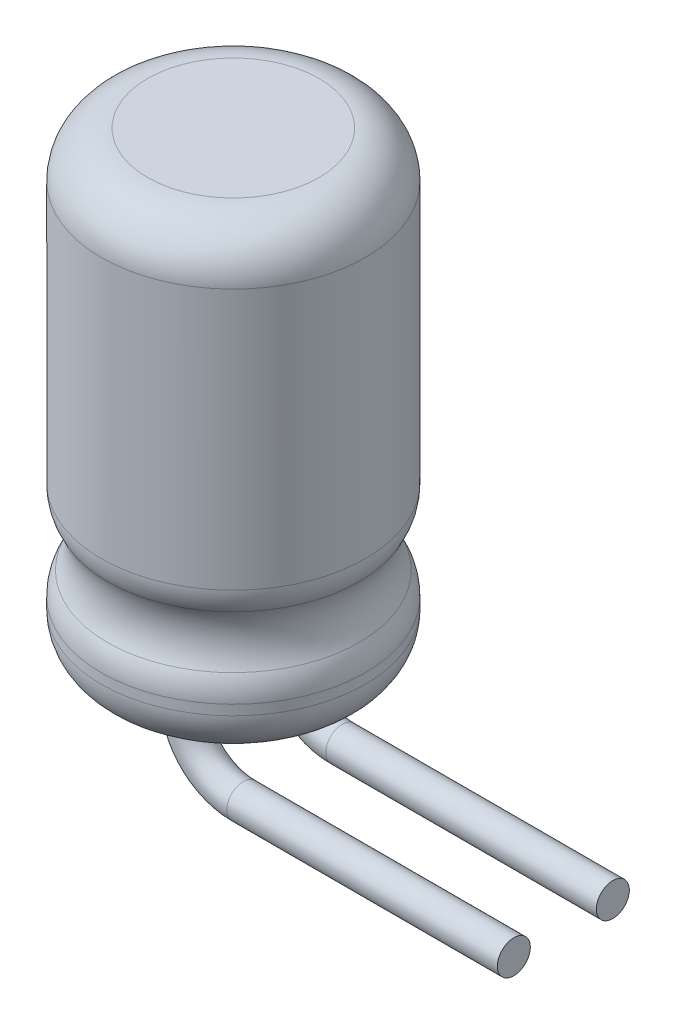
ISO-10303-21;
HEADER;
FILE_DESCRIPTION(('STEP AP214'),'2;1');
FILE_NAME('part.step','',(''),(''),'','','');
FILE_SCHEMA(('AUTOMOTIVE_DESIGN { 1 0 10303 214 1 1 1 1 }'));
ENDSEC;
DATA;
#1=APPLICATION_CONTEXT('core data for automotive mechanical design processes');
#2=APPLICATION_PROTOCOL_DEFINITION('international standard','automotive_design',2000,#1);
#3=PRODUCT_CONTEXT('',#1,'mechanical');
#4=PRODUCT('Part','Part','',(#3));
#5=PRODUCT_RELATED_PRODUCT_CATEGORY('part','',(#4));
#6=PRODUCT_DEFINITION_FORMATION('','',#4);
#7=PRODUCT_DEFINITION_CONTEXT('part definition',#1,'design');
#8=PRODUCT_DEFINITION('design','',#6,#7);
#9=PRODUCT_DEFINITION_SHAPE('','',#8);
#10=(LENGTH_UNIT() NAMED_UNIT(*) SI_UNIT(.MILLI.,.METRE.));
#11=(NAMED_UNIT(*) PLANE_ANGLE_UNIT() SI_UNIT($,.RADIAN.));
#12=(NAMED_UNIT(*) SI_UNIT($,.STERADIAN.) SOLID_ANGLE_UNIT());
#13=UNCERTAINTY_MEASURE_WITH_UNIT(LENGTH_MEASURE(1.E-05),#10,'distance_accuracy_value','');
#14=(GEOMETRIC_REPRESENTATION_CONTEXT(3) GLOBAL_UNCERTAINTY_ASSIGNED_CONTEXT((#13)) GLOBAL_UNIT_ASSIGNED_CONTEXT((#10,
#11,#12)) REPRESENTATION_CONTEXT('',''));
#15=CARTESIAN_POINT('',(0.,0.,0.));
#16=DIRECTION('',(0.,0.,1.));
#17=DIRECTION('',(1.,0.,0.));
#18=AXIS2_PLACEMENT_3D('',#15,#16,#17);
#19=CARTESIAN_POINT('',(0.,7.,0.));
#20=DIRECTION('',(0.,-1.,0.));
#21=DIRECTION('',(0.,0.,-1.));
#22=AXIS2_PLACEMENT_3D('',#19,#20,#21);
#23=CYLINDRICAL_SURFACE('',#22,2.);
#24=CARTESIAN_POINT('',(0.,0.851668522645212,0.));
#25=DIRECTION('',(0.,1.,0.));
#26=DIRECTION('',(0.,0.,1.));
#27=AXIS2_PLACEMENT_3D('',#24,#25,#26);
#28=CIRCLE('',#27,2.);
#29=CARTESIAN_POINT('',(0.,0.851668522645212,2.));
#30=VERTEX_POINT('',#29);
#31=EDGE_CURVE('E86',#30,#30,#28,.F.);
#32=ORIENTED_EDGE('',*,*,#31,.T.);
#33=EDGE_LOOP('',(#32));
#34=FACE_BOUND('',#33,.T.);
#35=CARTESIAN_POINT('',(0.,0.7,0.));
#36=DIRECTION('',(0.,1.,0.));
#37=DIRECTION('',(0.,0.,1.));
#38=AXIS2_PLACEMENT_3D('',#35,#36,#37);
#39=CIRCLE('',#38,2.);
#40=CARTESIAN_POINT('',(0.,0.7,2.));
#41=VERTEX_POINT('',#40);
#42=EDGE_CURVE('E74',#41,#41,#39,.T.);
#43=ORIENTED_EDGE('',*,*,#42,.T.);
#44=EDGE_LOOP('',(#43));
#45=FACE_BOUND('',#44,.T.);
#46=ADVANCED_FACE('F37',(#34,#45),#23,.T.);
#47=CARTESIAN_POINT('',(0.,0.,0.));
#48=DIRECTION('',(0.,1.,0.));
#49=DIRECTION('',(0.,0.,1.));
#50=AXIS2_PLACEMENT_3D('',#47,#48,#49);
#51=PLANE('',#50);
#52=CARTESIAN_POINT('',(0.,0.,0.));
#53=DIRECTION('',(0.,1.,0.));
#54=DIRECTION('',(0.,0.,1.));
#55=AXIS2_PLACEMENT_3D('',#52,#53,#54);
#56=CIRCLE('',#55,1.3);
#57=CARTESIAN_POINT('',(0.,0.,1.3));
#58=VERTEX_POINT('',#57);
#59=EDGE_CURVE('E77',#58,#58,#56,.F.);
#60=ORIENTED_EDGE('',*,*,#59,.T.);
#61=EDGE_LOOP('',(#60));
#62=FACE_BOUND('',#61,.T.);
#63=CARTESIAN_POINT('',(0.,0.,-0.75));
#64=DIRECTION('',(0.,1.,0.));
#65=DIRECTION('',(0.,0.,1.));
#66=AXIS2_PLACEMENT_3D('',#63,#64,#65);
#67=CIRCLE('',#66,0.25);
#68=CARTESIAN_POINT('',(0.,0.,-0.5));
#69=VERTEX_POINT('',#68);
#70=EDGE_CURVE('E284',#69,#69,#67,.F.);
#71=ORIENTED_EDGE('',*,*,#70,.F.);
#72=EDGE_LOOP('',(#71));
#73=FACE_BOUND('',#72,.T.);
#74=CARTESIAN_POINT('',(0.,0.,0.75));
#75=DIRECTION('',(0.,-1.,0.));
#76=DIRECTION('',(0.,0.,-1.));
#77=AXIS2_PLACEMENT_3D('',#74,#75,#76);
#78=CIRCLE('',#77,0.25);
#79=CARTESIAN_POINT('',(0.,0.,0.5));
#80=VERTEX_POINT('',#79);
#81=EDGE_CURVE('E57',#80,#80,#78,.T.);
#82=ORIENTED_EDGE('',*,*,#81,.F.);
#83=EDGE_LOOP('',(#82));
#84=FACE_BOUND('',#83,.T.);
#85=ADVANCED_FACE('F106',(#62,#73,#84),#51,.F.);
#86=CARTESIAN_POINT('',(5.,-1.,0.75));
#87=DIRECTION('',(1.,0.,0.));
#88=DIRECTION('',(0.,0.,-1.));
#89=AXIS2_PLACEMENT_3D('',#86,#87,#88);
#90=PLANE('',#89);
#91=CARTESIAN_POINT('',(5.,-1.,0.75));
#92=DIRECTION('',(1.,0.,0.));
#93=DIRECTION('',(0.,0.,-1.));
#94=AXIS2_PLACEMENT_3D('',#91,#92,#93);
#95=CIRCLE('',#94,0.25);
#96=CARTESIAN_POINT('',(5.,-1.,0.5));
#97=VERTEX_POINT('',#96);
#98=EDGE_CURVE('E50',#97,#97,#95,.T.);
#99=ORIENTED_EDGE('',*,*,#98,.T.);
#100=EDGE_LOOP('',(#99));
#101=FACE_BOUND('',#100,.T.);
#102=ADVANCED_FACE('F112',(#101),#90,.T.);
#103=CARTESIAN_POINT('',(0.,0.,0.75));
#104=DIRECTION('',(0.,-1.,0.));
#105=DIRECTION('',(0.,0.,-1.));
#106=AXIS2_PLACEMENT_3D('',#103,#104,#105);
#107=CYLINDRICAL_SURFACE('',#106,0.25);
#108=CARTESIAN_POINT('',(0.,-0.1,0.75));
#109=DIRECTION('',(0.,-1.,0.));
#110=DIRECTION('',(0.,0.,-1.));
#111=AXIS2_PLACEMENT_3D('',#108,#109,#110);
#112=CIRCLE('',#111,0.25);
#113=CARTESIAN_POINT('',(-0.25,-0.1,0.75));
#114=VERTEX_POINT('',#113);
#115=EDGE_CURVE('E61',#114,#114,#112,.T.);
#116=ORIENTED_EDGE('',*,*,#115,.F.);
#117=EDGE_LOOP('',(#116));
#118=FACE_BOUND('',#117,.T.);
#119=ORIENTED_EDGE('',*,*,#81,.T.);
#120=EDGE_LOOP('',(#119));
#121=FACE_BOUND('',#120,.T.);
#122=ADVANCED_FACE('F162',(#118,#121),#107,.T.);
#123=CARTESIAN_POINT('',(0.9,-0.1,0.75));
#124=DIRECTION('',(0.,0.,1.));
#125=DIRECTION('',(1.,0.,0.));
#126=AXIS2_PLACEMENT_3D('',#123,#124,#125);
#127=TOROIDAL_SURFACE('',#126,0.9,0.25);
#128=CARTESIAN_POINT('',(0.9,-1.,0.75));
#129=DIRECTION('',(1.,0.,0.));
#130=DIRECTION('',(0.,0.,-1.));
#131=AXIS2_PLACEMENT_3D('',#128,#129,#130);
#132=CIRCLE('',#131,0.25);
#133=CARTESIAN_POINT('',(0.9,-1.25,0.75));
#134=VERTEX_POINT('',#133);
#135=EDGE_CURVE('E70',#134,#134,#132,.T.);
#136=CARTESIAN_POINT('',(0.9,-0.1,0.75));
#137=DIRECTION('',(0.,0.,1.));
#138=DIRECTION('',(1.,0.,0.));
#139=AXIS2_PLACEMENT_3D('',#136,#137,#138);
#140=CIRCLE('',#139,1.15);
#141=EDGE_CURVE('',#114,#134,#140,.T.);
#142=ORIENTED_EDGE('',*,*,#115,.T.);
#143=ORIENTED_EDGE('',*,*,#135,.F.);
#144=ORIENTED_EDGE('',*,*,#141,.T.);
#145=ORIENTED_EDGE('',*,*,#141,.F.);
#146=EDGE_LOOP('',(#142,#144,#143,#145));
#147=FACE_BOUND('',#146,.T.);
#148=ADVANCED_FACE('F157',(#147),#127,.T.);
#149=CARTESIAN_POINT('',(0.9,-1.,0.75));
#150=DIRECTION('',(1.,0.,0.));
#151=DIRECTION('',(0.,0.,-1.));
#152=AXIS2_PLACEMENT_3D('',#149,#150,#151);
#153=CYLINDRICAL_SURFACE('',#152,0.25);
#154=ORIENTED_EDGE('',*,*,#98,.F.);
#155=EDGE_LOOP('',(#154));
#156=FACE_BOUND('',#155,.T.);
#157=ORIENTED_EDGE('',*,*,#135,.T.);
#158=EDGE_LOOP('',(#157));
#159=FACE_BOUND('',#158,.T.);
#160=ADVANCED_FACE('F115',(#156,#159),#153,.T.);
#161=CARTESIAN_POINT('',(5.,-1.,-0.75));
#162=DIRECTION('',(1.,0.,0.));
#163=DIRECTION('',(0.,0.,1.));
#164=AXIS2_PLACEMENT_3D('',#161,#162,#163);
#165=PLANE('',#164);
#166=CARTESIAN_POINT('',(5.,-1.,-0.75));
#167=DIRECTION('',(-1.,0.,0.));
#168=DIRECTION('',(0.,0.,1.));
#169=AXIS2_PLACEMENT_3D('',#166,#167,#168);
#170=CIRCLE('',#169,0.25);
#171=CARTESIAN_POINT('',(5.,-1.,-0.5));
#172=VERTEX_POINT('',#171);
#173=EDGE_CURVE('E54',#172,#172,#170,.F.);
#174=ORIENTED_EDGE('',*,*,#173,.T.);
#175=EDGE_LOOP('',(#174));
#176=FACE_BOUND('',#175,.T.);
#177=ADVANCED_FACE('F55',(#176),#165,.T.);
#178=CARTESIAN_POINT('',(0.,0.,-0.75));
#179=DIRECTION('',(0.,-1.,0.));
#180=DIRECTION('',(0.,0.,-1.));
#181=AXIS2_PLACEMENT_3D('',#178,#179,#180);
#182=CYLINDRICAL_SURFACE('',#181,0.25);
#183=CARTESIAN_POINT('',(0.,-0.1,-0.75));
#184=DIRECTION('',(0.,1.,0.));
#185=DIRECTION('',(0.,0.,1.));
#186=AXIS2_PLACEMENT_3D('',#183,#184,#185);
#187=CIRCLE('',#186,0.25);
#188=CARTESIAN_POINT('',(-0.25,-0.1,-0.75));
#189=VERTEX_POINT('',#188);
#190=EDGE_CURVE('E64',#189,#189,#187,.F.);
#191=ORIENTED_EDGE('',*,*,#190,.F.);
#192=EDGE_LOOP('',(#191));
#193=FACE_BOUND('',#192,.T.);
#194=ORIENTED_EDGE('',*,*,#70,.T.);
#195=EDGE_LOOP('',(#194));
#196=FACE_BOUND('',#195,.T.);
#197=ADVANCED_FACE('F149',(#193,#196),#182,.T.);
#198=CARTESIAN_POINT('',(0.9,-0.1,-0.75));
#199=DIRECTION('',(0.,0.,1.));
#200=DIRECTION('',(1.,0.,0.));
#201=AXIS2_PLACEMENT_3D('',#198,#199,#200);
#202=TOROIDAL_SURFACE('',#201,0.9,0.25);
#203=CARTESIAN_POINT('',(0.9,-1.,-0.75));
#204=DIRECTION('',(-1.,0.,0.));
#205=DIRECTION('',(0.,0.,1.));
#206=AXIS2_PLACEMENT_3D('',#203,#204,#205);
#207=CIRCLE('',#206,0.25);
#208=CARTESIAN_POINT('',(0.9,-1.25,-0.75));
#209=VERTEX_POINT('',#208);
#210=EDGE_CURVE('E58',#209,#209,#207,.F.);
#211=CARTESIAN_POINT('',(0.9,-0.1,-0.75));
#212=DIRECTION('',(0.,0.,1.));
#213=DIRECTION('',(1.,0.,0.));
#214=AXIS2_PLACEMENT_3D('',#211,#212,#213);
#215=CIRCLE('',#214,1.15);
#216=EDGE_CURVE('',#189,#209,#215,.T.);
#217=ORIENTED_EDGE('',*,*,#190,.T.);
#218=ORIENTED_EDGE('',*,*,#210,.F.);
#219=ORIENTED_EDGE('',*,*,#216,.T.);
#220=ORIENTED_EDGE('',*,*,#216,.F.);
#221=EDGE_LOOP('',(#217,#219,#218,#220));
#222=FACE_BOUND('',#221,.T.);
#223=ADVANCED_FACE('F144',(#222),#202,.T.);
#224=CARTESIAN_POINT('',(0.9,-1.,-0.75));
#225=DIRECTION('',(1.,0.,0.));
#226=DIRECTION('',(0.,0.,-1.));
#227=AXIS2_PLACEMENT_3D('',#224,#225,#226);
#228=CYLINDRICAL_SURFACE('',#227,0.25);
#229=ORIENTED_EDGE('',*,*,#173,.F.);
#230=EDGE_LOOP('',(#229));
#231=FACE_BOUND('',#230,.T.);
#232=ORIENTED_EDGE('',*,*,#210,.T.);
#233=EDGE_LOOP('',(#232));
#234=FACE_BOUND('',#233,.T.);
#235=ADVANCED_FACE('F136',(#231,#234),#228,.T.);
#236=CARTESIAN_POINT('',(0.,0.7,0.));
#237=DIRECTION('',(0.,1.,0.));
#238=DIRECTION('',(0.,0.,1.));
#239=AXIS2_PLACEMENT_3D('',#236,#237,#238);
#240=TOROIDAL_SURFACE('',#239,1.3,0.7);
#241=ORIENTED_EDGE('',*,*,#59,.F.);
#242=EDGE_LOOP('',(#241));
#243=FACE_BOUND('',#242,.T.);
#244=ORIENTED_EDGE('',*,*,#42,.F.);
#245=EDGE_LOOP('',(#244));
#246=FACE_BOUND('',#245,.T.);
#247=ADVANCED_FACE('F134',(#243,#246),#240,.T.);
#248=CARTESIAN_POINT('',(0.,1.6,0.));
#249=DIRECTION('',(0.,1.,0.));
#250=DIRECTION('',(0.,0.,1.));
#251=AXIS2_PLACEMENT_3D('',#248,#249,#250);
#252=TOROIDAL_SURFACE('',#251,2.6,0.8);
#253=CARTESIAN_POINT('',(0.,1.99911012125589,0.));
#254=DIRECTION('',(0.,-1.,0.));
#255=DIRECTION('',(0.,0.,-1.));
#256=AXIS2_PLACEMENT_3D('',#253,#254,#255);
#257=CIRCLE('',#256,1.90666666666667);
#258=CARTESIAN_POINT('',(0.,1.99911012125589,-1.90666666666667));
#259=VERTEX_POINT('',#258);
#260=EDGE_CURVE('E11',#259,#259,#257,.T.);
#261=ORIENTED_EDGE('',*,*,#260,.T.);
#262=EDGE_LOOP('',(#261));
#263=FACE_BOUND('',#262,.T.);
#264=CARTESIAN_POINT('',(0.,1.20088987874411,0.));
#265=DIRECTION('',(0.,1.,0.));
#266=DIRECTION('',(0.,0.,1.));
#267=AXIS2_PLACEMENT_3D('',#264,#265,#266);
#268=CIRCLE('',#267,1.90666666666667);
#269=CARTESIAN_POINT('',(0.,1.20088987874411,1.90666666666667));
#270=VERTEX_POINT('',#269);
#271=EDGE_CURVE('E89',#270,#270,#268,.T.);
#272=ORIENTED_EDGE('',*,*,#271,.T.);
#273=EDGE_LOOP('',(#272));
#274=FACE_BOUND('',#273,.T.);
#275=ADVANCED_FACE('F129',(#263,#274),#252,.F.);
#276=CARTESIAN_POINT('',(0.,7.,0.));
#277=DIRECTION('',(0.,1.,0.));
#278=DIRECTION('',(0.,0.,1.));
#279=AXIS2_PLACEMENT_3D('',#276,#277,#278);
#280=PLANE('',#279);
#281=CARTESIAN_POINT('',(0.,7.,0.));
#282=DIRECTION('',(0.,1.,0.));
#283=DIRECTION('',(0.,0.,1.));
#284=AXIS2_PLACEMENT_3D('',#281,#282,#283);
#285=CIRCLE('',#284,1.3);
#286=CARTESIAN_POINT('',(0.,7.,1.3));
#287=VERTEX_POINT('',#286);
#288=EDGE_CURVE('E80',#287,#287,#285,.T.);
#289=ORIENTED_EDGE('',*,*,#288,.T.);
#290=EDGE_LOOP('',(#289));
#291=FACE_BOUND('',#290,.T.);
#292=ADVANCED_FACE('F123',(#291),#280,.T.);
#293=CARTESIAN_POINT('',(0.,6.3,0.));
#294=DIRECTION('',(0.,1.,0.));
#295=DIRECTION('',(0.,0.,1.));
#296=AXIS2_PLACEMENT_3D('',#293,#294,#295);
#297=TOROIDAL_SURFACE('',#296,1.3,0.7);
#298=CARTESIAN_POINT('',(0.,6.3,0.));
#299=DIRECTION('',(0.,1.,0.));
#300=DIRECTION('',(0.,0.,1.));
#301=AXIS2_PLACEMENT_3D('',#298,#299,#300);
#302=CIRCLE('',#301,2.);
#303=CARTESIAN_POINT('',(0.,6.3,2.));
#304=VERTEX_POINT('',#303);
#305=EDGE_CURVE('E83',#304,#304,#302,.F.);
#306=ORIENTED_EDGE('',*,*,#305,.F.);
#307=EDGE_LOOP('',(#306));
#308=FACE_BOUND('',#307,.T.);
#309=ORIENTED_EDGE('',*,*,#288,.F.);
#310=EDGE_LOOP('',(#309));
#311=FACE_BOUND('',#310,.T.);
#312=ADVANCED_FACE('F119',(#308,#311),#297,.T.);
#313=CARTESIAN_POINT('',(0.,2.34833147735479,0.));
#314=DIRECTION('',(0.,-1.,0.));
#315=DIRECTION('',(0.,0.,-1.));
#316=AXIS2_PLACEMENT_3D('',#313,#314,#315);
#317=CIRCLE('',#316,2.);
#318=CARTESIAN_POINT('',(0.,2.34833147735479,-2.));
#319=VERTEX_POINT('',#318);
#320=EDGE_CURVE('E45',#319,#319,#317,.F.);
#321=ORIENTED_EDGE('',*,*,#320,.T.);
#322=EDGE_LOOP('',(#321));
#323=FACE_BOUND('',#322,.T.);
#324=ORIENTED_EDGE('',*,*,#305,.T.);
#325=EDGE_LOOP('',(#324));
#326=FACE_BOUND('',#325,.T.);
#327=ADVANCED_FACE('F94',(#323,#326),#23,.T.);
#328=CARTESIAN_POINT('',(0.,0.851668522645212,0.));
#329=DIRECTION('',(0.,1.,0.));
#330=DIRECTION('',(0.,0.,1.));
#331=AXIS2_PLACEMENT_3D('',#328,#329,#330);
#332=TOROIDAL_SURFACE('',#331,1.3,0.7);
#333=ORIENTED_EDGE('',*,*,#271,.F.);
#334=EDGE_LOOP('',(#333));
#335=FACE_BOUND('',#334,.T.);
#336=ORIENTED_EDGE('',*,*,#31,.F.);
#337=EDGE_LOOP('',(#336));
#338=FACE_BOUND('',#337,.T.);
#339=ADVANCED_FACE('F98',(#335,#338),#332,.T.);
#340=CARTESIAN_POINT('',(0.,2.34833147735479,0.));
#341=DIRECTION('',(0.,-1.,0.));
#342=DIRECTION('',(0.,0.,-1.));
#343=AXIS2_PLACEMENT_3D('',#340,#341,#342);
#344=TOROIDAL_SURFACE('',#343,1.3,0.7);
#345=ORIENTED_EDGE('',*,*,#260,.F.);
#346=EDGE_LOOP('',(#345));
#347=FACE_BOUND('',#346,.T.);
#348=ORIENTED_EDGE('',*,*,#320,.F.);
#349=EDGE_LOOP('',(#348));
#350=FACE_BOUND('',#349,.T.);
#351=ADVANCED_FACE('F39',(#347,#350),#344,.T.);
#352=CLOSED_SHELL('',(#46,#85,#102,#122,#148,#160,#177,#197,#223,#235,#247,#275,#292,#312,#327,
#339,#351));
#353=MANIFOLD_SOLID_BREP('B2',#352);
#354=ADVANCED_BREP_SHAPE_REPRESENTATION('',(#18,#353),#14);
#355=SHAPE_DEFINITION_REPRESENTATION(#9,#354);
ENDSEC;
END-ISO-10303-21;
